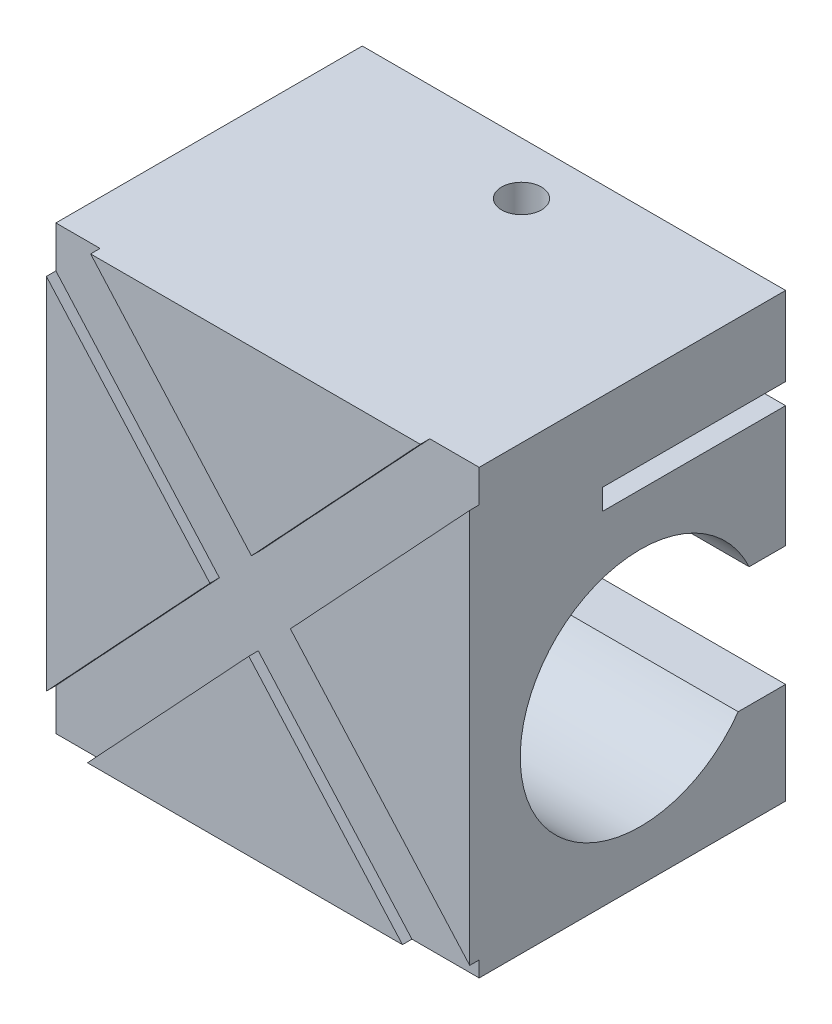
ISO-10303-21;
HEADER;
FILE_DESCRIPTION(('STEP AP214'),'2;1');
FILE_NAME('part.step','',(''),(''),'','','');
FILE_SCHEMA(('AUTOMOTIVE_DESIGN { 1 0 10303 214 1 1 1 1 }'));
ENDSEC;
DATA;
#1=APPLICATION_CONTEXT('core data for automotive mechanical design processes');
#2=APPLICATION_PROTOCOL_DEFINITION('international standard','automotive_design',2000,#1);
#3=PRODUCT_CONTEXT('',#1,'mechanical');
#4=PRODUCT('Part','Part','',(#3));
#5=PRODUCT_RELATED_PRODUCT_CATEGORY('part','',(#4));
#6=PRODUCT_DEFINITION_FORMATION('','',#4);
#7=PRODUCT_DEFINITION_CONTEXT('part definition',#1,'design');
#8=PRODUCT_DEFINITION('design','',#6,#7);
#9=PRODUCT_DEFINITION_SHAPE('','',#8);
#10=(LENGTH_UNIT() NAMED_UNIT(*) SI_UNIT(.MILLI.,.METRE.));
#11=(NAMED_UNIT(*) PLANE_ANGLE_UNIT() SI_UNIT($,.RADIAN.));
#12=(NAMED_UNIT(*) SI_UNIT($,.STERADIAN.) SOLID_ANGLE_UNIT());
#13=UNCERTAINTY_MEASURE_WITH_UNIT(LENGTH_MEASURE(1.E-05),#10,'distance_accuracy_value','');
#14=(GEOMETRIC_REPRESENTATION_CONTEXT(3) GLOBAL_UNCERTAINTY_ASSIGNED_CONTEXT((#13)) GLOBAL_UNIT_ASSIGNED_CONTEXT((#10,
#11,#12)) REPRESENTATION_CONTEXT('',''));
#15=CARTESIAN_POINT('',(0.,0.,0.));
#16=DIRECTION('',(0.,0.,1.));
#17=DIRECTION('',(1.,0.,0.));
#18=AXIS2_PLACEMENT_3D('',#15,#16,#17);
#19=CARTESIAN_POINT('',(0.,70.,50.));
#20=DIRECTION('',(0.,0.,-1.));
#21=DIRECTION('',(-1.,0.,0.));
#22=AXIS2_PLACEMENT_3D('',#19,#20,#21);
#23=PLANE('',#22);
#24=DIRECTION('',(-0.66424114077176,0.74751836559795,0.));
#25=VECTOR('',#24,1.);
#26=CARTESIAN_POINT('',(67.,2.47768139780385,50.));
#27=LINE('',#26,#25);
#28=CARTESIAN_POINT('',(32.4550236121591,41.3536297605561,50.));
#29=VERTEX_POINT('',#28);
#30=CARTESIAN_POINT('',(7.,70.,50.));
#31=VERTEX_POINT('',#30);
#32=EDGE_CURVE('E303',#29,#31,#27,.T.);
#33=ORIENTED_EDGE('',*,*,#32,.F.);
#34=DIRECTION('',(-0.682155602084624,-0.731207039452277,0.));
#35=VECTOR('',#34,1.);
#36=CARTESIAN_POINT('',(0.,6.56487825242635,50.));
#37=LINE('',#36,#35);
#38=CARTESIAN_POINT('',(59.1797142727751,70.,50.));
#39=VERTEX_POINT('',#38);
#40=EDGE_CURVE('E203',#39,#29,#37,.T.);
#41=ORIENTED_EDGE('',*,*,#40,.F.);
#42=DIRECTION('',(1.,0.,0.));
#43=VECTOR('',#42,1.);
#44=CARTESIAN_POINT('',(0.,70.,50.));
#45=LINE('',#44,#43);
#46=EDGE_CURVE('E272',#31,#39,#45,.T.);
#47=ORIENTED_EDGE('',*,*,#46,.F.);
#48=EDGE_LOOP('',(#33,#41,#47));
#49=FACE_BOUND('',#48,.T.);
#50=ADVANCED_FACE('F33',(#49),#23,.F.);
#51=DIRECTION('',(0.,-1.,0.));
#52=VECTOR('',#51,1.);
#53=CARTESIAN_POINT('',(0.,70.,50.));
#54=LINE('',#53,#52);
#55=CARTESIAN_POINT('',(0.,63.4250211666504,50.));
#56=VERTEX_POINT('',#55);
#57=CARTESIAN_POINT('',(0.,6.56487825242635,50.));
#58=VERTEX_POINT('',#57);
#59=EDGE_CURVE('E245',#56,#58,#54,.T.);
#60=ORIENTED_EDGE('',*,*,#59,.T.);
#61=CARTESIAN_POINT('',(25.8775311944195,34.303172734186,50.));
#62=VERTEX_POINT('',#61);
#63=EDGE_CURVE('E461',#62,#58,#37,.T.);
#64=ORIENTED_EDGE('',*,*,#63,.F.);
#65=DIRECTION('',(0.66424114077176,-0.74751836559795,0.));
#66=VECTOR('',#65,1.);
#67=CARTESIAN_POINT('',(0.,63.4250211666504,50.));
#68=LINE('',#67,#66);
#69=EDGE_CURVE('E319',#56,#62,#68,.T.);
#70=ORIENTED_EDGE('',*,*,#69,.F.);
#71=EDGE_LOOP('',(#60,#64,#70));
#72=FACE_BOUND('',#71,.T.);
#73=ADVANCED_FACE('F397',(#72),#23,.F.);
#74=CARTESIAN_POINT('',(67.,2.47768139780385,48.5));
#75=DIRECTION('',(0.74751836559795,0.66424114077176,0.));
#76=DIRECTION('',(-0.66424114077176,0.74751836559795,0.));
#77=AXIS2_PLACEMENT_3D('',#74,#75,#76);
#78=PLANE('',#77);
#79=DIRECTION('',(-0.66424114077176,0.74751836559795,0.));
#80=VECTOR('',#79,1.);
#81=CARTESIAN_POINT('',(67.,2.47768139780385,48.5));
#82=LINE('',#81,#80);
#83=CARTESIAN_POINT('',(32.4550236121591,41.3536297605561,48.5));
#84=VERTEX_POINT('',#83);
#85=CARTESIAN_POINT('',(7.,70.,48.5));
#86=VERTEX_POINT('',#85);
#87=EDGE_CURVE('E314',#84,#86,#82,.T.);
#88=ORIENTED_EDGE('',*,*,#87,.F.);
#89=DIRECTION('',(0.,0.,1.));
#90=VECTOR('',#89,1.);
#91=CARTESIAN_POINT('',(32.4550236121591,41.3536297605561,48.5));
#92=LINE('',#91,#90);
#93=EDGE_CURVE('E306',#84,#29,#92,.T.);
#94=ORIENTED_EDGE('',*,*,#93,.T.);
#95=ORIENTED_EDGE('',*,*,#32,.T.);
#96=DIRECTION('',(0.,0.,1.));
#97=VECTOR('',#96,1.);
#98=CARTESIAN_POINT('',(7.,70.,48.5));
#99=LINE('',#98,#97);
#100=EDGE_CURVE('E323',#86,#31,#99,.T.);
#101=ORIENTED_EDGE('',*,*,#100,.F.);
#102=EDGE_LOOP('',(#88,#94,#95,#101));
#103=FACE_BOUND('',#102,.T.);
#104=ADVANCED_FACE('F403',(#103),#78,.F.);
#105=CARTESIAN_POINT('',(0.,63.4250211666504,48.5));
#106=DIRECTION('',(-0.74751836559795,-0.66424114077176,0.));
#107=DIRECTION('',(0.66424114077176,-0.74751836559795,0.));
#108=AXIS2_PLACEMENT_3D('',#105,#106,#107);
#109=PLANE('',#108);
#110=ORIENTED_EDGE('',*,*,#69,.T.);
#111=DIRECTION('',(0.,0.,-1.));
#112=VECTOR('',#111,1.);
#113=CARTESIAN_POINT('',(25.8775311944195,34.303172734186,48.5));
#114=LINE('',#113,#112);
#115=CARTESIAN_POINT('',(25.8775311944194,34.303172734186,48.5));
#116=VERTEX_POINT('',#115);
#117=EDGE_CURVE('E447',#62,#116,#114,.T.);
#118=ORIENTED_EDGE('',*,*,#117,.T.);
#119=DIRECTION('',(0.66424114077176,-0.74751836559795,0.));
#120=VECTOR('',#119,1.);
#121=CARTESIAN_POINT('',(0.,63.4250211666504,48.5));
#122=LINE('',#121,#120);
#123=CARTESIAN_POINT('',(0.,63.4250211666504,48.5));
#124=VERTEX_POINT('',#123);
#125=EDGE_CURVE('E300',#124,#116,#122,.T.);
#126=ORIENTED_EDGE('',*,*,#125,.F.);
#127=DIRECTION('',(0.,0.,1.));
#128=VECTOR('',#127,1.);
#129=CARTESIAN_POINT('',(0.,63.4250211666504,48.5));
#130=LINE('',#129,#128);
#131=EDGE_CURVE('E296',#124,#56,#130,.T.);
#132=ORIENTED_EDGE('',*,*,#131,.T.);
#133=EDGE_LOOP('',(#110,#118,#126,#132));
#134=FACE_BOUND('',#133,.T.);
#135=ADVANCED_FACE('F416',(#134),#109,.F.);
#136=DIRECTION('',(0.,-1.,0.));
#137=VECTOR('',#136,1.);
#138=CARTESIAN_POINT('',(67.,70.,50.));
#139=LINE('',#138,#137);
#140=CARTESIAN_POINT('',(67.,64.848472441259,50.));
#141=VERTEX_POINT('',#140);
#142=CARTESIAN_POINT('',(67.,2.47768139780385,50.));
#143=VERTEX_POINT('',#142);
#144=EDGE_CURVE('E242',#141,#143,#139,.T.);
#145=ORIENTED_EDGE('',*,*,#144,.F.);
#146=DIRECTION('',(0.682155602084624,0.731207039452277,0.));
#147=VECTOR('',#146,1.);
#148=CARTESIAN_POINT('',(67.,64.848472441259,50.));
#149=LINE('',#148,#147);
#150=CARTESIAN_POINT('',(38.6145263074273,34.421898036873,50.));
#151=VERTEX_POINT('',#150);
#152=EDGE_CURVE('E429',#151,#141,#149,.T.);
#153=ORIENTED_EDGE('',*,*,#152,.F.);
#154=EDGE_CURVE('E298',#143,#151,#27,.T.);
#155=ORIENTED_EDGE('',*,*,#154,.F.);
#156=EDGE_LOOP('',(#145,#153,#155));
#157=FACE_BOUND('',#156,.T.);
#158=ADVANCED_FACE('F405',(#157),#23,.F.);
#159=CARTESIAN_POINT('',(0.,70.,0.));
#160=DIRECTION('',(0.,0.,1.));
#161=DIRECTION('',(1.,0.,0.));
#162=AXIS2_PLACEMENT_3D('',#159,#160,#161);
#163=PLANE('',#162);
#164=DIRECTION('',(0.,-1.,0.));
#165=VECTOR('',#164,1.);
#166=CARTESIAN_POINT('',(0.,70.,0.));
#167=LINE('',#166,#165);
#168=CARTESIAN_POINT('',(0.,54.2,0.));
#169=VERTEX_POINT('',#168);
#170=CARTESIAN_POINT('',(0.,35.,0.));
#171=VERTEX_POINT('',#170);
#172=EDGE_CURVE('E238',#169,#171,#167,.T.);
#173=ORIENTED_EDGE('',*,*,#172,.F.);
#174=DIRECTION('',(1.,0.,0.));
#175=VECTOR('',#174,1.);
#176=CARTESIAN_POINT('',(-3.,54.2,0.));
#177=LINE('',#176,#175);
#178=CARTESIAN_POINT('',(67.,54.2,0.));
#179=VERTEX_POINT('',#178);
#180=EDGE_CURVE('E347',#169,#179,#177,.T.);
#181=ORIENTED_EDGE('',*,*,#180,.T.);
#182=DIRECTION('',(0.,-1.,0.));
#183=VECTOR('',#182,1.);
#184=CARTESIAN_POINT('',(67.,70.,0.));
#185=LINE('',#184,#183);
#186=CARTESIAN_POINT('',(67.,35.,0.));
#187=VERTEX_POINT('',#186);
#188=EDGE_CURVE('E243',#179,#187,#185,.T.);
#189=ORIENTED_EDGE('',*,*,#188,.T.);
#190=DIRECTION('',(1.,0.,0.));
#191=VECTOR('',#190,1.);
#192=CARTESIAN_POINT('',(-3.,35.,0.));
#193=LINE('',#192,#191);
#194=EDGE_CURVE('E266',#171,#187,#193,.T.);
#195=ORIENTED_EDGE('',*,*,#194,.F.);
#196=EDGE_LOOP('',(#173,#181,#189,#195));
#197=FACE_BOUND('',#196,.T.);
#198=ADVANCED_FACE('F379',(#197),#163,.F.);
#199=CARTESIAN_POINT('',(67.,70.,0.));
#200=VERTEX_POINT('',#199);
#201=CARTESIAN_POINT('',(67.,57.5,0.));
#202=VERTEX_POINT('',#201);
#203=EDGE_CURVE('E239',#200,#202,#185,.T.);
#204=ORIENTED_EDGE('',*,*,#203,.T.);
#205=DIRECTION('',(1.,0.,0.));
#206=VECTOR('',#205,1.);
#207=CARTESIAN_POINT('',(-3.,57.5,0.));
#208=LINE('',#207,#206);
#209=CARTESIAN_POINT('',(0.,57.5,0.));
#210=VERTEX_POINT('',#209);
#211=EDGE_CURVE('E289',#210,#202,#208,.T.);
#212=ORIENTED_EDGE('',*,*,#211,.F.);
#213=CARTESIAN_POINT('',(0.,70.,0.));
#214=VERTEX_POINT('',#213);
#215=EDGE_CURVE('E234',#214,#210,#167,.T.);
#216=ORIENTED_EDGE('',*,*,#215,.F.);
#217=DIRECTION('',(-1.,0.,0.));
#218=VECTOR('',#217,1.);
#219=CARTESIAN_POINT('',(0.,70.,0.));
#220=LINE('',#219,#218);
#221=EDGE_CURVE('E227',#200,#214,#220,.T.);
#222=ORIENTED_EDGE('',*,*,#221,.F.);
#223=EDGE_LOOP('',(#204,#212,#216,#222));
#224=FACE_BOUND('',#223,.T.);
#225=ADVANCED_FACE('F288',(#224),#163,.F.);
#226=CARTESIAN_POINT('',(0.,70.,0.));
#227=DIRECTION('',(1.,0.,0.));
#228=DIRECTION('',(0.,0.,-1.));
#229=AXIS2_PLACEMENT_3D('',#226,#227,#228);
#230=PLANE('',#229);
#231=DIRECTION('',(0.,-1.,0.));
#232=VECTOR('',#231,1.);
#233=CARTESIAN_POINT('',(0.,0.,48.5));
#234=LINE('',#233,#232);
#235=CARTESIAN_POINT('',(0.,6.56487825242635,48.5));
#236=VERTEX_POINT('',#235);
#237=CARTESIAN_POINT('',(0.,0.,48.5));
#238=VERTEX_POINT('',#237);
#239=EDGE_CURVE('E191',#236,#238,#234,.T.);
#240=ORIENTED_EDGE('',*,*,#239,.F.);
#241=DIRECTION('',(0.,0.,1.));
#242=VECTOR('',#241,1.);
#243=CARTESIAN_POINT('',(0.,6.56487825242635,48.5));
#244=LINE('',#243,#242);
#245=EDGE_CURVE('E454',#236,#58,#244,.T.);
#246=ORIENTED_EDGE('',*,*,#245,.T.);
#247=ORIENTED_EDGE('',*,*,#59,.F.);
#248=ORIENTED_EDGE('',*,*,#131,.F.);
#249=DIRECTION('',(0.,-1.,0.));
#250=VECTOR('',#249,1.);
#251=CARTESIAN_POINT('',(0.,70.,48.5));
#252=LINE('',#251,#250);
#253=CARTESIAN_POINT('',(0.,70.,48.5));
#254=VERTEX_POINT('',#253);
#255=EDGE_CURVE('E294',#254,#124,#252,.T.);
#256=ORIENTED_EDGE('',*,*,#255,.F.);
#257=DIRECTION('',(0.,0.,1.));
#258=VECTOR('',#257,1.);
#259=CARTESIAN_POINT('',(0.,70.,0.));
#260=LINE('',#259,#258);
#261=EDGE_CURVE('E233',#214,#254,#260,.T.);
#262=ORIENTED_EDGE('',*,*,#261,.F.);
#263=ORIENTED_EDGE('',*,*,#215,.T.);
#264=DIRECTION('',(0.,0.,1.));
#265=VECTOR('',#264,1.);
#266=CARTESIAN_POINT('',(0.,57.5,0.));
#267=LINE('',#266,#265);
#268=CARTESIAN_POINT('',(0.,57.5,29.));
#269=VERTEX_POINT('',#268);
#270=EDGE_CURVE('E350',#210,#269,#267,.T.);
#271=ORIENTED_EDGE('',*,*,#270,.T.);
#272=DIRECTION('',(0.,-1.,0.));
#273=VECTOR('',#272,1.);
#274=CARTESIAN_POINT('',(0.,70.,29.));
#275=LINE('',#274,#273);
#276=CARTESIAN_POINT('',(0.,54.2,29.));
#277=VERTEX_POINT('',#276);
#278=EDGE_CURVE('E357',#269,#277,#275,.T.);
#279=ORIENTED_EDGE('',*,*,#278,.T.);
#280=DIRECTION('',(0.,0.,-1.));
#281=VECTOR('',#280,1.);
#282=CARTESIAN_POINT('',(0.,54.2,0.));
#283=LINE('',#282,#281);
#284=EDGE_CURVE('E360',#277,#169,#283,.T.);
#285=ORIENTED_EDGE('',*,*,#284,.T.);
#286=ORIENTED_EDGE('',*,*,#172,.T.);
#287=DIRECTION('',(0.,0.,1.));
#288=VECTOR('',#287,1.);
#289=CARTESIAN_POINT('',(0.,35.,0.));
#290=LINE('',#289,#288);
#291=CARTESIAN_POINT('',(0.,35.,5.76631206038592));
#292=VERTEX_POINT('',#291);
#293=EDGE_CURVE('E258',#171,#292,#290,.T.);
#294=ORIENTED_EDGE('',*,*,#293,.T.);
#295=CARTESIAN_POINT('',(0.,27.,23.));
#296=DIRECTION('',(1.,0.,0.));
#297=DIRECTION('',(0.,0.,-1.));
#298=AXIS2_PLACEMENT_3D('',#295,#296,#297);
#299=CIRCLE('',#298,19.);
#300=CARTESIAN_POINT('',(0.,16.0025495436553,7.5062566350077));
#301=VERTEX_POINT('',#300);
#302=EDGE_CURVE('E219',#292,#301,#299,.T.);
#303=ORIENTED_EDGE('',*,*,#302,.T.);
#304=DIRECTION('',(0.,-0.000339655787454454,-0.999999942316971));
#305=VECTOR('',#304,1.);
#306=CARTESIAN_POINT('',(0.,16.0000062297669,0.0183414114645523));
#307=LINE('',#306,#305);
#308=CARTESIAN_POINT('',(0.,16.,0.));
#309=VERTEX_POINT('',#308);
#310=EDGE_CURVE('E256',#301,#309,#307,.T.);
#311=ORIENTED_EDGE('',*,*,#310,.T.);
#312=CARTESIAN_POINT('',(0.,0.,0.));
#313=VERTEX_POINT('',#312);
#314=EDGE_CURVE('E216',#309,#313,#167,.T.);
#315=ORIENTED_EDGE('',*,*,#314,.T.);
#316=DIRECTION('',(0.,0.,1.));
#317=VECTOR('',#316,1.);
#318=CARTESIAN_POINT('',(0.,0.,0.));
#319=LINE('',#318,#317);
#320=EDGE_CURVE('E210',#313,#238,#319,.T.);
#321=ORIENTED_EDGE('',*,*,#320,.T.);
#322=EDGE_LOOP('',(#240,#246,#247,#248,#256,#262,#263,#271,#279,#285,#286,#294,#303,#311,#315,#321));
#323=FACE_BOUND('',#322,.T.);
#324=ADVANCED_FACE('F35',(#323),#230,.F.);
#325=CARTESIAN_POINT('',(32.0370338896877,27.371441010503,50.));
#326=VERTEX_POINT('',#325);
#327=CARTESIAN_POINT('',(56.3591616635518,0.,50.));
#328=VERTEX_POINT('',#327);
#329=EDGE_CURVE('E321',#326,#328,#68,.T.);
#330=ORIENTED_EDGE('',*,*,#329,.F.);
#331=CARTESIAN_POINT('',(6.50174659755532,0.,50.));
#332=VERTEX_POINT('',#331);
#333=EDGE_CURVE('E462',#332,#326,#149,.T.);
#334=ORIENTED_EDGE('',*,*,#333,.F.);
#335=DIRECTION('',(1.,0.,0.));
#336=VECTOR('',#335,1.);
#337=CARTESIAN_POINT('',(0.,0.,50.));
#338=LINE('',#337,#336);
#339=EDGE_CURVE('E218',#332,#328,#338,.T.);
#340=ORIENTED_EDGE('',*,*,#339,.T.);
#341=EDGE_LOOP('',(#330,#334,#340));
#342=FACE_BOUND('',#341,.T.);
#343=ADVANCED_FACE('F399',(#342),#23,.F.);
#344=CARTESIAN_POINT('',(67.,70.,0.));
#345=DIRECTION('',(-1.,0.,0.));
#346=DIRECTION('',(0.,0.,1.));
#347=AXIS2_PLACEMENT_3D('',#344,#345,#346);
#348=PLANE('',#347);
#349=DIRECTION('',(0.,1.,0.));
#350=VECTOR('',#349,1.);
#351=CARTESIAN_POINT('',(67.,70.,48.5));
#352=LINE('',#351,#350);
#353=CARTESIAN_POINT('',(67.,64.848472441259,48.5));
#354=VERTEX_POINT('',#353);
#355=CARTESIAN_POINT('',(67.,70.,48.5));
#356=VERTEX_POINT('',#355);
#357=EDGE_CURVE('E467',#354,#356,#352,.T.);
#358=ORIENTED_EDGE('',*,*,#357,.F.);
#359=DIRECTION('',(0.,0.,1.));
#360=VECTOR('',#359,1.);
#361=CARTESIAN_POINT('',(67.,64.848472441259,48.5));
#362=LINE('',#361,#360);
#363=EDGE_CURVE('E433',#354,#141,#362,.T.);
#364=ORIENTED_EDGE('',*,*,#363,.T.);
#365=ORIENTED_EDGE('',*,*,#144,.T.);
#366=DIRECTION('',(0.,0.,1.));
#367=VECTOR('',#366,1.);
#368=CARTESIAN_POINT('',(67.,2.47768139780385,48.5));
#369=LINE('',#368,#367);
#370=CARTESIAN_POINT('',(67.,2.47768139780385,48.5));
#371=VERTEX_POINT('',#370);
#372=EDGE_CURVE('E327',#371,#143,#369,.T.);
#373=ORIENTED_EDGE('',*,*,#372,.F.);
#374=DIRECTION('',(0.,1.,0.));
#375=VECTOR('',#374,1.);
#376=CARTESIAN_POINT('',(67.,0.,48.5));
#377=LINE('',#376,#375);
#378=CARTESIAN_POINT('',(67.,0.,48.5));
#379=VERTEX_POINT('',#378);
#380=EDGE_CURVE('E311',#379,#371,#377,.T.);
#381=ORIENTED_EDGE('',*,*,#380,.F.);
#382=DIRECTION('',(0.,0.,-1.));
#383=VECTOR('',#382,1.);
#384=CARTESIAN_POINT('',(67.,0.,0.));
#385=LINE('',#384,#383);
#386=CARTESIAN_POINT('',(67.,0.,0.));
#387=VERTEX_POINT('',#386);
#388=EDGE_CURVE('E221',#379,#387,#385,.T.);
#389=ORIENTED_EDGE('',*,*,#388,.T.);
#390=CARTESIAN_POINT('',(67.,16.,0.));
#391=VERTEX_POINT('',#390);
#392=EDGE_CURVE('E237',#391,#387,#185,.T.);
#393=ORIENTED_EDGE('',*,*,#392,.F.);
#394=DIRECTION('',(0.,-0.000339655787454454,-0.999999942316971));
#395=VECTOR('',#394,1.);
#396=CARTESIAN_POINT('',(67.,16.,0.));
#397=LINE('',#396,#395);
#398=CARTESIAN_POINT('',(67.,16.0025495436553,7.5062566350077));
#399=VERTEX_POINT('',#398);
#400=EDGE_CURVE('E362',#399,#391,#397,.T.);
#401=ORIENTED_EDGE('',*,*,#400,.F.);
#402=CARTESIAN_POINT('',(67.,27.,23.));
#403=DIRECTION('',(1.,0.,0.));
#404=DIRECTION('',(0.,0.,-1.));
#405=AXIS2_PLACEMENT_3D('',#402,#403,#404);
#406=CIRCLE('',#405,19.);
#407=CARTESIAN_POINT('',(67.,35.,5.76631206038593));
#408=VERTEX_POINT('',#407);
#409=EDGE_CURVE('E224',#408,#399,#406,.T.);
#410=ORIENTED_EDGE('',*,*,#409,.F.);
#411=DIRECTION('',(0.,0.,1.));
#412=VECTOR('',#411,1.);
#413=CARTESIAN_POINT('',(67.,35.,0.));
#414=LINE('',#413,#412);
#415=EDGE_CURVE('E364',#187,#408,#414,.T.);
#416=ORIENTED_EDGE('',*,*,#415,.F.);
#417=ORIENTED_EDGE('',*,*,#188,.F.);
#418=DIRECTION('',(0.,0.,-1.));
#419=VECTOR('',#418,1.);
#420=CARTESIAN_POINT('',(67.,54.2,0.));
#421=LINE('',#420,#419);
#422=CARTESIAN_POINT('',(67.,54.2,29.));
#423=VERTEX_POINT('',#422);
#424=EDGE_CURVE('E345',#423,#179,#421,.T.);
#425=ORIENTED_EDGE('',*,*,#424,.F.);
#426=DIRECTION('',(0.,-1.,0.));
#427=VECTOR('',#426,1.);
#428=CARTESIAN_POINT('',(67.,57.5,29.));
#429=LINE('',#428,#427);
#430=CARTESIAN_POINT('',(67.,57.5,29.));
#431=VERTEX_POINT('',#430);
#432=EDGE_CURVE('E342',#431,#423,#429,.T.);
#433=ORIENTED_EDGE('',*,*,#432,.F.);
#434=DIRECTION('',(0.,0.,1.));
#435=VECTOR('',#434,1.);
#436=CARTESIAN_POINT('',(67.,57.5,0.));
#437=LINE('',#436,#435);
#438=EDGE_CURVE('E339',#202,#431,#437,.T.);
#439=ORIENTED_EDGE('',*,*,#438,.F.);
#440=ORIENTED_EDGE('',*,*,#203,.F.);
#441=DIRECTION('',(0.,0.,-1.));
#442=VECTOR('',#441,1.);
#443=CARTESIAN_POINT('',(67.,70.,0.));
#444=LINE('',#443,#442);
#445=EDGE_CURVE('E274',#356,#200,#444,.T.);
#446=ORIENTED_EDGE('',*,*,#445,.F.);
#447=EDGE_LOOP('',(#358,#364,#365,#373,#381,#389,#393,#401,#410,#416,#417,#425,#433,#439,#440,#446));
#448=FACE_BOUND('',#447,.T.);
#449=ADVANCED_FACE('F374',(#448),#348,.F.);
#450=ORIENTED_EDGE('',*,*,#314,.F.);
#451=DIRECTION('',(1.,0.,0.));
#452=VECTOR('',#451,1.);
#453=CARTESIAN_POINT('',(-3.,16.,0.));
#454=LINE('',#453,#452);
#455=EDGE_CURVE('E366',#309,#391,#454,.T.);
#456=ORIENTED_EDGE('',*,*,#455,.T.);
#457=ORIENTED_EDGE('',*,*,#392,.T.);
#458=DIRECTION('',(-1.,0.,0.));
#459=VECTOR('',#458,1.);
#460=CARTESIAN_POINT('',(0.,0.,0.));
#461=LINE('',#460,#459);
#462=EDGE_CURVE('E231',#387,#313,#461,.T.);
#463=ORIENTED_EDGE('',*,*,#462,.T.);
#464=EDGE_LOOP('',(#450,#456,#457,#463));
#465=FACE_BOUND('',#464,.T.);
#466=ADVANCED_FACE('F371',(#465),#163,.F.);
#467=CARTESIAN_POINT('',(0.,70.,0.));
#468=DIRECTION('',(0.,1.,0.));
#469=DIRECTION('',(0.,0.,1.));
#470=AXIS2_PLACEMENT_3D('',#467,#468,#469);
#471=PLANE('',#470);
#472=DIRECTION('',(0.,0.,1.));
#473=VECTOR('',#472,1.);
#474=CARTESIAN_POINT('',(59.1797142727751,70.,48.5));
#475=LINE('',#474,#473);
#476=CARTESIAN_POINT('',(59.1797142727751,70.,48.5));
#477=VERTEX_POINT('',#476);
#478=EDGE_CURVE('E457',#477,#39,#475,.T.);
#479=ORIENTED_EDGE('',*,*,#478,.F.);
#480=DIRECTION('',(-1.,0.,0.));
#481=VECTOR('',#480,1.);
#482=CARTESIAN_POINT('',(59.1797142727751,70.,48.5));
#483=LINE('',#482,#481);
#484=EDGE_CURVE('E465',#356,#477,#483,.T.);
#485=ORIENTED_EDGE('',*,*,#484,.F.);
#486=ORIENTED_EDGE('',*,*,#445,.T.);
#487=ORIENTED_EDGE('',*,*,#221,.T.);
#488=ORIENTED_EDGE('',*,*,#261,.T.);
#489=DIRECTION('',(-1.,0.,0.));
#490=VECTOR('',#489,1.);
#491=CARTESIAN_POINT('',(7.,70.,48.5));
#492=LINE('',#491,#490);
#493=EDGE_CURVE('E317',#86,#254,#492,.T.);
#494=ORIENTED_EDGE('',*,*,#493,.F.);
#495=ORIENTED_EDGE('',*,*,#100,.T.);
#496=ORIENTED_EDGE('',*,*,#46,.T.);
#497=EDGE_LOOP('',(#479,#485,#486,#487,#488,#494,#495,#496));
#498=FACE_BOUND('',#497,.T.);
#499=CARTESIAN_POINT('',(33.5,70.,8.3));
#500=DIRECTION('',(0.,1.,0.));
#501=DIRECTION('',(0.,0.,1.));
#502=AXIS2_PLACEMENT_3D('',#499,#500,#501);
#503=CIRCLE('',#502,3.15);
#504=CARTESIAN_POINT('',(33.5,70.,11.45));
#505=VERTEX_POINT('',#504);
#506=EDGE_CURVE('E326',#505,#505,#503,.T.);
#507=ORIENTED_EDGE('',*,*,#506,.F.);
#508=EDGE_LOOP('',(#507));
#509=FACE_BOUND('',#508,.T.);
#510=ADVANCED_FACE('F282',(#498,#509),#471,.T.);
#511=CARTESIAN_POINT('',(0.,0.,0.));
#512=DIRECTION('',(0.,1.,0.));
#513=DIRECTION('',(0.,0.,1.));
#514=AXIS2_PLACEMENT_3D('',#511,#512,#513);
#515=PLANE('',#514);
#516=ORIENTED_EDGE('',*,*,#339,.F.);
#517=DIRECTION('',(0.,0.,1.));
#518=VECTOR('',#517,1.);
#519=CARTESIAN_POINT('',(6.50174659755532,0.,48.5));
#520=LINE('',#519,#518);
#521=CARTESIAN_POINT('',(6.50174659755532,0.,48.5));
#522=VERTEX_POINT('',#521);
#523=EDGE_CURVE('E211',#522,#332,#520,.T.);
#524=ORIENTED_EDGE('',*,*,#523,.F.);
#525=DIRECTION('',(1.,0.,0.));
#526=VECTOR('',#525,1.);
#527=CARTESIAN_POINT('',(6.50174659755532,0.,48.5));
#528=LINE('',#527,#526);
#529=EDGE_CURVE('E195',#238,#522,#528,.T.);
#530=ORIENTED_EDGE('',*,*,#529,.F.);
#531=ORIENTED_EDGE('',*,*,#320,.F.);
#532=ORIENTED_EDGE('',*,*,#462,.F.);
#533=ORIENTED_EDGE('',*,*,#388,.F.);
#534=DIRECTION('',(1.,0.,0.));
#535=VECTOR('',#534,1.);
#536=CARTESIAN_POINT('',(56.3591616635518,0.,48.5));
#537=LINE('',#536,#535);
#538=CARTESIAN_POINT('',(56.3591616635518,0.,48.5));
#539=VERTEX_POINT('',#538);
#540=EDGE_CURVE('E309',#539,#379,#537,.T.);
#541=ORIENTED_EDGE('',*,*,#540,.F.);
#542=DIRECTION('',(0.,0.,1.));
#543=VECTOR('',#542,1.);
#544=CARTESIAN_POINT('',(56.3591616635518,0.,48.5));
#545=LINE('',#544,#543);
#546=EDGE_CURVE('E330',#539,#328,#545,.T.);
#547=ORIENTED_EDGE('',*,*,#546,.T.);
#548=EDGE_LOOP('',(#516,#524,#530,#531,#532,#533,#541,#547));
#549=FACE_BOUND('',#548,.T.);
#550=ADVANCED_FACE('F208',(#549),#515,.F.);
#551=CARTESIAN_POINT('',(-3.,27.,23.));
#552=DIRECTION('',(1.,0.,0.));
#553=DIRECTION('',(0.,0.,-1.));
#554=AXIS2_PLACEMENT_3D('',#551,#552,#553);
#555=CYLINDRICAL_SURFACE('',#554,19.);
#556=ORIENTED_EDGE('',*,*,#302,.F.);
#557=DIRECTION('',(1.,0.,0.));
#558=VECTOR('',#557,1.);
#559=CARTESIAN_POINT('',(-3.,35.,5.76631206038592));
#560=LINE('',#559,#558);
#561=EDGE_CURVE('E11',#292,#408,#560,.T.);
#562=ORIENTED_EDGE('',*,*,#561,.T.);
#563=ORIENTED_EDGE('',*,*,#409,.T.);
#564=DIRECTION('',(1.,0.,0.));
#565=VECTOR('',#564,1.);
#566=CARTESIAN_POINT('',(-3.,16.0025495436553,7.5062566350077));
#567=LINE('',#566,#565);
#568=EDGE_CURVE('E41',#399,#301,#567,.F.);
#569=ORIENTED_EDGE('',*,*,#568,.T.);
#570=EDGE_LOOP('',(#556,#562,#563,#569));
#571=FACE_BOUND('',#570,.T.);
#572=ADVANCED_FACE('F251',(#571),#555,.F.);
#573=CARTESIAN_POINT('',(-3.,16.,0.));
#574=DIRECTION('',(0.,-0.999999942316971,0.000339655787454454));
#575=DIRECTION('',(0.,-0.000339655787454454,-0.999999942316971));
#576=AXIS2_PLACEMENT_3D('',#573,#574,#575);
#577=PLANE('',#576);
#578=ORIENTED_EDGE('',*,*,#568,.F.);
#579=ORIENTED_EDGE('',*,*,#400,.T.);
#580=ORIENTED_EDGE('',*,*,#455,.F.);
#581=ORIENTED_EDGE('',*,*,#310,.F.);
#582=EDGE_LOOP('',(#578,#579,#580,#581));
#583=FACE_BOUND('',#582,.T.);
#584=ADVANCED_FACE('F385',(#583),#577,.F.);
#585=CARTESIAN_POINT('',(-3.,35.,0.));
#586=DIRECTION('',(0.,1.,0.));
#587=DIRECTION('',(0.,0.,1.));
#588=AXIS2_PLACEMENT_3D('',#585,#586,#587);
#589=PLANE('',#588);
#590=ORIENTED_EDGE('',*,*,#194,.T.);
#591=ORIENTED_EDGE('',*,*,#415,.T.);
#592=ORIENTED_EDGE('',*,*,#561,.F.);
#593=ORIENTED_EDGE('',*,*,#293,.F.);
#594=EDGE_LOOP('',(#590,#591,#592,#593));
#595=FACE_BOUND('',#594,.T.);
#596=ADVANCED_FACE('F382',(#595),#589,.F.);
#597=CARTESIAN_POINT('',(-3.,54.2,0.));
#598=DIRECTION('',(0.,-1.,0.));
#599=DIRECTION('',(0.,0.,-1.));
#600=AXIS2_PLACEMENT_3D('',#597,#598,#599);
#601=PLANE('',#600);
#602=DIRECTION('',(1.,0.,0.));
#603=VECTOR('',#602,1.);
#604=CARTESIAN_POINT('',(-3.,54.2,29.));
#605=LINE('',#604,#603);
#606=EDGE_CURVE('E351',#277,#423,#605,.T.);
#607=ORIENTED_EDGE('',*,*,#606,.T.);
#608=ORIENTED_EDGE('',*,*,#424,.T.);
#609=ORIENTED_EDGE('',*,*,#180,.F.);
#610=ORIENTED_EDGE('',*,*,#284,.F.);
#611=EDGE_LOOP('',(#607,#608,#609,#610));
#612=FACE_BOUND('',#611,.T.);
#613=ADVANCED_FACE('F384',(#612),#601,.F.);
#614=CARTESIAN_POINT('',(-3.,57.5,29.));
#615=DIRECTION('',(0.,0.,1.));
#616=DIRECTION('',(1.,0.,0.));
#617=AXIS2_PLACEMENT_3D('',#614,#615,#616);
#618=PLANE('',#617);
#619=DIRECTION('',(1.,0.,0.));
#620=VECTOR('',#619,1.);
#621=CARTESIAN_POINT('',(-3.,57.5,29.));
#622=LINE('',#621,#620);
#623=EDGE_CURVE('E353',#269,#431,#622,.T.);
#624=ORIENTED_EDGE('',*,*,#623,.T.);
#625=ORIENTED_EDGE('',*,*,#432,.T.);
#626=ORIENTED_EDGE('',*,*,#606,.F.);
#627=ORIENTED_EDGE('',*,*,#278,.F.);
#628=EDGE_LOOP('',(#624,#625,#626,#627));
#629=FACE_BOUND('',#628,.T.);
#630=ADVANCED_FACE('F391',(#629),#618,.F.);
#631=CARTESIAN_POINT('',(-3.,57.5,0.));
#632=DIRECTION('',(0.,1.,0.));
#633=DIRECTION('',(0.,0.,1.));
#634=AXIS2_PLACEMENT_3D('',#631,#632,#633);
#635=PLANE('',#634);
#636=CARTESIAN_POINT('',(33.5,57.5,8.3));
#637=DIRECTION('',(0.,1.,0.));
#638=DIRECTION('',(0.,0.,1.));
#639=AXIS2_PLACEMENT_3D('',#636,#637,#638);
#640=CIRCLE('',#639,3.15);
#641=CARTESIAN_POINT('',(33.5,57.5,11.45));
#642=VERTEX_POINT('',#641);
#643=EDGE_CURVE('E336',#642,#642,#640,.F.);
#644=ORIENTED_EDGE('',*,*,#643,.F.);
#645=EDGE_LOOP('',(#644));
#646=FACE_BOUND('',#645,.T.);
#647=ORIENTED_EDGE('',*,*,#211,.T.);
#648=ORIENTED_EDGE('',*,*,#438,.T.);
#649=ORIENTED_EDGE('',*,*,#623,.F.);
#650=ORIENTED_EDGE('',*,*,#270,.F.);
#651=EDGE_LOOP('',(#647,#648,#649,#650));
#652=FACE_BOUND('',#651,.T.);
#653=ADVANCED_FACE('F475',(#646,#652),#635,.F.);
#654=CARTESIAN_POINT('',(33.5,48.5904545570495,8.3));
#655=DIRECTION('',(0.,1.,0.));
#656=DIRECTION('',(0.,0.,1.));
#657=AXIS2_PLACEMENT_3D('',#654,#655,#656);
#658=CYLINDRICAL_SURFACE('',#657,3.15);
#659=ORIENTED_EDGE('',*,*,#643,.T.);
#660=EDGE_LOOP('',(#659));
#661=FACE_BOUND('',#660,.T.);
#662=ORIENTED_EDGE('',*,*,#506,.T.);
#663=EDGE_LOOP('',(#662));
#664=FACE_BOUND('',#663,.T.);
#665=ADVANCED_FACE('F483',(#661,#664),#658,.F.);
#666=ORIENTED_EDGE('',*,*,#154,.T.);
#667=DIRECTION('',(0.,0.,-1.));
#668=VECTOR('',#667,1.);
#669=CARTESIAN_POINT('',(38.6145263074273,34.421898036873,48.5));
#670=LINE('',#669,#668);
#671=CARTESIAN_POINT('',(38.6145263074273,34.421898036873,48.5));
#672=VERTEX_POINT('',#671);
#673=EDGE_CURVE('E437',#151,#672,#670,.T.);
#674=ORIENTED_EDGE('',*,*,#673,.T.);
#675=EDGE_CURVE('E315',#371,#672,#82,.T.);
#676=ORIENTED_EDGE('',*,*,#675,.F.);
#677=ORIENTED_EDGE('',*,*,#372,.T.);
#678=EDGE_LOOP('',(#666,#674,#676,#677));
#679=FACE_BOUND('',#678,.T.);
#680=ADVANCED_FACE('F435',(#679),#78,.F.);
#681=CARTESIAN_POINT('',(32.0370338896876,27.371441010503,48.5));
#682=VERTEX_POINT('',#681);
#683=EDGE_CURVE('E297',#682,#539,#122,.T.);
#684=ORIENTED_EDGE('',*,*,#683,.F.);
#685=DIRECTION('',(0.,0.,1.));
#686=VECTOR('',#685,1.);
#687=CARTESIAN_POINT('',(32.0370338896876,27.371441010503,48.5));
#688=LINE('',#687,#686);
#689=EDGE_CURVE('E444',#682,#326,#688,.T.);
#690=ORIENTED_EDGE('',*,*,#689,.T.);
#691=ORIENTED_EDGE('',*,*,#329,.T.);
#692=ORIENTED_EDGE('',*,*,#546,.F.);
#693=EDGE_LOOP('',(#684,#690,#691,#692));
#694=FACE_BOUND('',#693,.T.);
#695=ADVANCED_FACE('F425',(#694),#109,.F.);
#696=CARTESIAN_POINT('',(0.,0.,48.5));
#697=DIRECTION('',(0.,0.,1.));
#698=DIRECTION('',(1.,0.,0.));
#699=AXIS2_PLACEMENT_3D('',#696,#697,#698);
#700=PLANE('',#699);
#701=ORIENTED_EDGE('',*,*,#675,.T.);
#702=DIRECTION('',(0.682155602084624,0.731207039452277,0.));
#703=VECTOR('',#702,1.);
#704=CARTESIAN_POINT('',(67.,64.848472441259,48.5));
#705=LINE('',#704,#703);
#706=EDGE_CURVE('E212',#672,#354,#705,.T.);
#707=ORIENTED_EDGE('',*,*,#706,.T.);
#708=ORIENTED_EDGE('',*,*,#357,.T.);
#709=ORIENTED_EDGE('',*,*,#484,.T.);
#710=DIRECTION('',(-0.682155602084624,-0.731207039452277,0.));
#711=VECTOR('',#710,1.);
#712=CARTESIAN_POINT('',(0.,6.56487825242635,48.5));
#713=LINE('',#712,#711);
#714=EDGE_CURVE('E48',#477,#84,#713,.T.);
#715=ORIENTED_EDGE('',*,*,#714,.T.);
#716=ORIENTED_EDGE('',*,*,#87,.T.);
#717=ORIENTED_EDGE('',*,*,#493,.T.);
#718=ORIENTED_EDGE('',*,*,#255,.T.);
#719=ORIENTED_EDGE('',*,*,#125,.T.);
#720=EDGE_CURVE('E198',#116,#236,#713,.T.);
#721=ORIENTED_EDGE('',*,*,#720,.T.);
#722=ORIENTED_EDGE('',*,*,#239,.T.);
#723=ORIENTED_EDGE('',*,*,#529,.T.);
#724=EDGE_CURVE('E55',#522,#682,#705,.T.);
#725=ORIENTED_EDGE('',*,*,#724,.T.);
#726=ORIENTED_EDGE('',*,*,#683,.T.);
#727=ORIENTED_EDGE('',*,*,#540,.T.);
#728=ORIENTED_EDGE('',*,*,#380,.T.);
#729=EDGE_LOOP('',(#701,#707,#708,#709,#715,#716,#717,#718,#719,#721,#722,#723,#725,#726,#727,#728));
#730=FACE_BOUND('',#729,.T.);
#731=ADVANCED_FACE('F194',(#730),#700,.T.);
#732=CARTESIAN_POINT('',(67.,64.848472441259,48.5));
#733=DIRECTION('',(0.731207039452277,-0.682155602084624,0.));
#734=DIRECTION('',(0.682155602084624,0.731207039452277,0.));
#735=AXIS2_PLACEMENT_3D('',#732,#733,#734);
#736=PLANE('',#735);
#737=ORIENTED_EDGE('',*,*,#724,.F.);
#738=ORIENTED_EDGE('',*,*,#523,.T.);
#739=ORIENTED_EDGE('',*,*,#333,.T.);
#740=ORIENTED_EDGE('',*,*,#689,.F.);
#741=EDGE_LOOP('',(#737,#738,#739,#740));
#742=FACE_BOUND('',#741,.T.);
#743=ADVANCED_FACE('F494',(#742),#736,.F.);
#744=CARTESIAN_POINT('',(0.,6.56487825242635,48.5));
#745=DIRECTION('',(-0.731207039452277,0.682155602084624,0.));
#746=DIRECTION('',(-0.682155602084624,-0.731207039452277,0.));
#747=AXIS2_PLACEMENT_3D('',#744,#745,#746);
#748=PLANE('',#747);
#749=ORIENTED_EDGE('',*,*,#63,.T.);
#750=ORIENTED_EDGE('',*,*,#245,.F.);
#751=ORIENTED_EDGE('',*,*,#720,.F.);
#752=ORIENTED_EDGE('',*,*,#117,.F.);
#753=EDGE_LOOP('',(#749,#750,#751,#752));
#754=FACE_BOUND('',#753,.T.);
#755=ADVANCED_FACE('F499',(#754),#748,.F.);
#756=ORIENTED_EDGE('',*,*,#714,.F.);
#757=ORIENTED_EDGE('',*,*,#478,.T.);
#758=ORIENTED_EDGE('',*,*,#40,.T.);
#759=ORIENTED_EDGE('',*,*,#93,.F.);
#760=EDGE_LOOP('',(#756,#757,#758,#759));
#761=FACE_BOUND('',#760,.T.);
#762=ADVANCED_FACE('F497',(#761),#748,.F.);
#763=ORIENTED_EDGE('',*,*,#152,.T.);
#764=ORIENTED_EDGE('',*,*,#363,.F.);
#765=ORIENTED_EDGE('',*,*,#706,.F.);
#766=ORIENTED_EDGE('',*,*,#673,.F.);
#767=EDGE_LOOP('',(#763,#764,#765,#766));
#768=FACE_BOUND('',#767,.T.);
#769=ADVANCED_FACE('F470',(#768),#736,.F.);
#770=CLOSED_SHELL('',(#50,#73,#104,#135,#158,#198,#225,#324,#343,#449,#466,#510,#550,#572,#584,
#596,#613,#630,#653,#665,#680,#695,#731,#743,#755,#762,#769));
#771=MANIFOLD_SOLID_BREP('B2',#770);
#772=ADVANCED_BREP_SHAPE_REPRESENTATION('',(#18,#771),#14);
#773=SHAPE_DEFINITION_REPRESENTATION(#9,#772);
ENDSEC;
END-ISO-10303-21;
